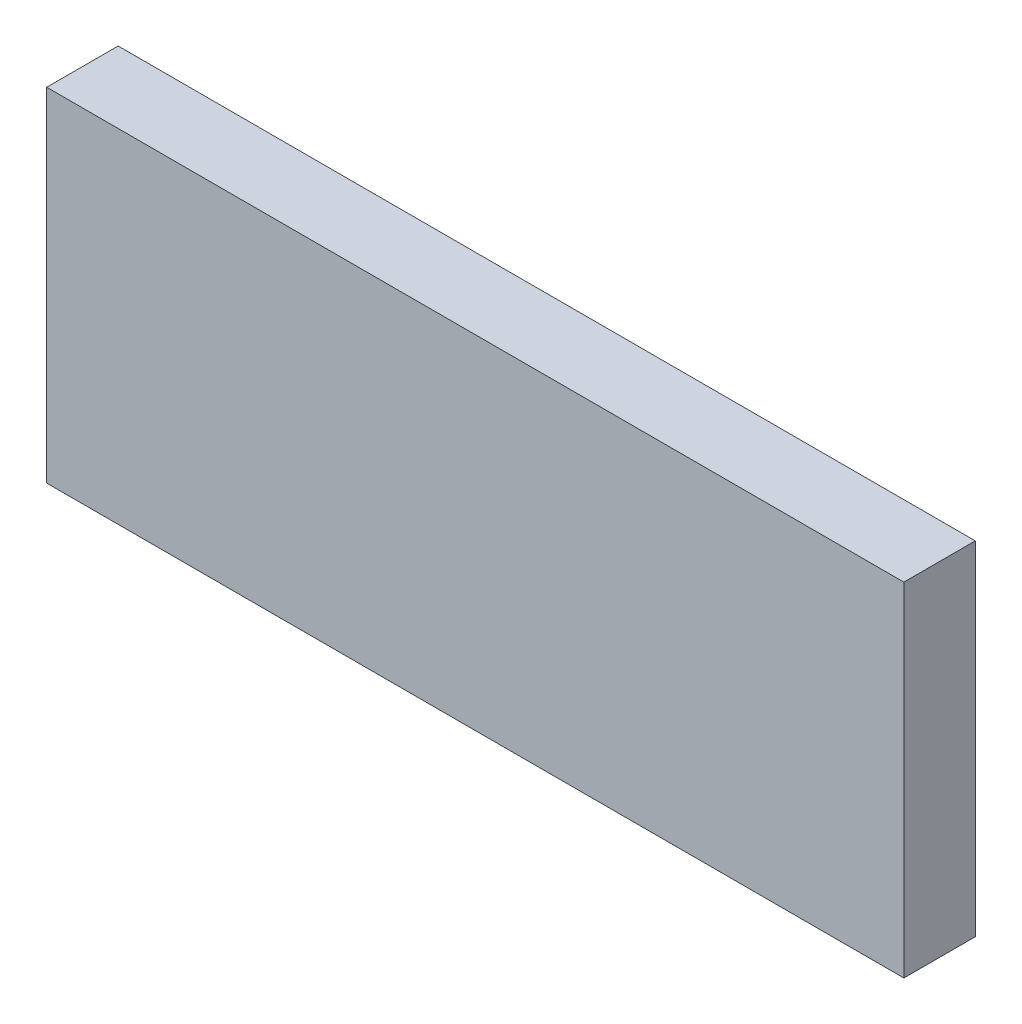
ISO-10303-21;
HEADER;
FILE_DESCRIPTION(('STEP AP214'),'2;1');
FILE_NAME('part.step','',(''),(''),'','','');
FILE_SCHEMA(('AUTOMOTIVE_DESIGN { 1 0 10303 214 1 1 1 1 }'));
ENDSEC;
DATA;
#1=APPLICATION_CONTEXT('core data for automotive mechanical design processes');
#2=APPLICATION_PROTOCOL_DEFINITION('international standard','automotive_design',2000,#1);
#3=PRODUCT_CONTEXT('',#1,'mechanical');
#4=PRODUCT('Part','Part','',(#3));
#5=PRODUCT_RELATED_PRODUCT_CATEGORY('part','',(#4));
#6=PRODUCT_DEFINITION_FORMATION('','',#4);
#7=PRODUCT_DEFINITION_CONTEXT('part definition',#1,'design');
#8=PRODUCT_DEFINITION('design','',#6,#7);
#9=PRODUCT_DEFINITION_SHAPE('','',#8);
#10=(LENGTH_UNIT() NAMED_UNIT(*) SI_UNIT(.MILLI.,.METRE.));
#11=(NAMED_UNIT(*) PLANE_ANGLE_UNIT() SI_UNIT($,.RADIAN.));
#12=(NAMED_UNIT(*) SI_UNIT($,.STERADIAN.) SOLID_ANGLE_UNIT());
#13=UNCERTAINTY_MEASURE_WITH_UNIT(LENGTH_MEASURE(1.E-05),#10,'distance_accuracy_value','');
#14=(GEOMETRIC_REPRESENTATION_CONTEXT(3) GLOBAL_UNCERTAINTY_ASSIGNED_CONTEXT((#13)) GLOBAL_UNIT_ASSIGNED_CONTEXT((#10,
#11,#12)) REPRESENTATION_CONTEXT('',''));
#15=CARTESIAN_POINT('',(0.,0.,0.));
#16=DIRECTION('',(0.,0.,1.));
#17=DIRECTION('',(1.,0.,0.));
#18=AXIS2_PLACEMENT_3D('',#15,#16,#17);
#19=CARTESIAN_POINT('',(-1.641156891067,0.,0.1));
#20=DIRECTION('',(0.,0.,1.));
#21=DIRECTION('',(1.,0.,0.));
#22=AXIS2_PLACEMENT_3D('',#19,#20,#21);
#23=PLANE('',#22);
#24=DIRECTION('',(1.,0.,0.));
#25=VECTOR('',#24,1.);
#26=CARTESIAN_POINT('',(-2.241156891067,0.24,0.1));
#27=LINE('',#26,#25);
#28=CARTESIAN_POINT('',(-2.241156891067,0.24,0.1));
#29=VERTEX_POINT('',#28);
#30=CARTESIAN_POINT('',(-1.041156891067,0.24,0.1));
#31=VERTEX_POINT('',#30);
#32=EDGE_CURVE('E90',#29,#31,#27,.T.);
#33=ORIENTED_EDGE('',*,*,#32,.F.);
#34=DIRECTION('',(0.,1.,0.));
#35=VECTOR('',#34,1.);
#36=CARTESIAN_POINT('',(-2.241156891067,-0.24,0.1));
#37=LINE('',#36,#35);
#38=CARTESIAN_POINT('',(-2.241156891067,-0.24,0.1));
#39=VERTEX_POINT('',#38);
#40=EDGE_CURVE('E21',#39,#29,#37,.T.);
#41=ORIENTED_EDGE('',*,*,#40,.F.);
#42=DIRECTION('',(-1.,0.,0.));
#43=VECTOR('',#42,1.);
#44=CARTESIAN_POINT('',(-1.041156891067,-0.24,0.1));
#45=LINE('',#44,#43);
#46=CARTESIAN_POINT('',(-1.041156891067,-0.24,0.1));
#47=VERTEX_POINT('',#46);
#48=EDGE_CURVE('E63',#47,#39,#45,.T.);
#49=ORIENTED_EDGE('',*,*,#48,.F.);
#50=DIRECTION('',(0.,-1.,0.));
#51=VECTOR('',#50,1.);
#52=CARTESIAN_POINT('',(-1.041156891067,0.24,0.1));
#53=LINE('',#52,#51);
#54=EDGE_CURVE('E92',#31,#47,#53,.T.);
#55=ORIENTED_EDGE('',*,*,#54,.F.);
#56=EDGE_LOOP('',(#33,#41,#49,#55));
#57=FACE_BOUND('',#56,.T.);
#58=ADVANCED_FACE('F17',(#57),#23,.T.);
#59=CARTESIAN_POINT('',(-1.641156891067,0.,0.));
#60=DIRECTION('',(0.,0.,1.));
#61=DIRECTION('',(1.,0.,0.));
#62=AXIS2_PLACEMENT_3D('',#59,#60,#61);
#63=PLANE('',#62);
#64=DIRECTION('',(1.,0.,0.));
#65=VECTOR('',#64,1.);
#66=CARTESIAN_POINT('',(-2.241156891067,0.24,0.));
#67=LINE('',#66,#65);
#68=CARTESIAN_POINT('',(-2.241156891067,0.24,0.));
#69=VERTEX_POINT('',#68);
#70=CARTESIAN_POINT('',(-1.041156891067,0.24,0.));
#71=VERTEX_POINT('',#70);
#72=EDGE_CURVE('E99',#69,#71,#67,.T.);
#73=ORIENTED_EDGE('',*,*,#72,.T.);
#74=DIRECTION('',(0.,-1.,0.));
#75=VECTOR('',#74,1.);
#76=CARTESIAN_POINT('',(-1.041156891067,0.24,0.));
#77=LINE('',#76,#75);
#78=CARTESIAN_POINT('',(-1.041156891067,-0.24,0.));
#79=VERTEX_POINT('',#78);
#80=EDGE_CURVE('E75',#71,#79,#77,.T.);
#81=ORIENTED_EDGE('',*,*,#80,.T.);
#82=DIRECTION('',(-1.,0.,0.));
#83=VECTOR('',#82,1.);
#84=CARTESIAN_POINT('',(-1.041156891067,-0.24,0.));
#85=LINE('',#84,#83);
#86=CARTESIAN_POINT('',(-2.241156891067,-0.24,0.));
#87=VERTEX_POINT('',#86);
#88=EDGE_CURVE('E88',#79,#87,#85,.T.);
#89=ORIENTED_EDGE('',*,*,#88,.T.);
#90=DIRECTION('',(0.,1.,0.));
#91=VECTOR('',#90,1.);
#92=CARTESIAN_POINT('',(-2.241156891067,-0.24,0.));
#93=LINE('',#92,#91);
#94=EDGE_CURVE('E11',#87,#69,#93,.T.);
#95=ORIENTED_EDGE('',*,*,#94,.T.);
#96=EDGE_LOOP('',(#73,#81,#89,#95));
#97=FACE_BOUND('',#96,.T.);
#98=ADVANCED_FACE('F19',(#97),#63,.F.);
#99=CARTESIAN_POINT('',(-2.241156891067,-0.24,0.));
#100=DIRECTION('',(-1.,0.,0.));
#101=DIRECTION('',(0.,0.,1.));
#102=AXIS2_PLACEMENT_3D('',#99,#100,#101);
#103=PLANE('',#102);
#104=DIRECTION('',(0.,0.,1.));
#105=VECTOR('',#104,1.);
#106=CARTESIAN_POINT('',(-2.241156891067,-0.24,0.));
#107=LINE('',#106,#105);
#108=EDGE_CURVE('E86',#87,#39,#107,.T.);
#109=ORIENTED_EDGE('',*,*,#108,.T.);
#110=ORIENTED_EDGE('',*,*,#40,.T.);
#111=DIRECTION('',(0.,0.,1.));
#112=VECTOR('',#111,1.);
#113=CARTESIAN_POINT('',(-2.241156891067,0.24,0.));
#114=LINE('',#113,#112);
#115=EDGE_CURVE('E84',#69,#29,#114,.T.);
#116=ORIENTED_EDGE('',*,*,#115,.F.);
#117=ORIENTED_EDGE('',*,*,#94,.F.);
#118=EDGE_LOOP('',(#109,#110,#116,#117));
#119=FACE_BOUND('',#118,.T.);
#120=ADVANCED_FACE('F82',(#119),#103,.T.);
#121=CARTESIAN_POINT('',(-1.041156891067,-0.24,0.));
#122=DIRECTION('',(0.,-1.,0.));
#123=DIRECTION('',(0.,0.,-1.));
#124=AXIS2_PLACEMENT_3D('',#121,#122,#123);
#125=PLANE('',#124);
#126=DIRECTION('',(0.,0.,1.));
#127=VECTOR('',#126,1.);
#128=CARTESIAN_POINT('',(-1.041156891067,-0.24,0.));
#129=LINE('',#128,#127);
#130=EDGE_CURVE('E106',#79,#47,#129,.T.);
#131=ORIENTED_EDGE('',*,*,#130,.T.);
#132=ORIENTED_EDGE('',*,*,#48,.T.);
#133=ORIENTED_EDGE('',*,*,#108,.F.);
#134=ORIENTED_EDGE('',*,*,#88,.F.);
#135=EDGE_LOOP('',(#131,#132,#133,#134));
#136=FACE_BOUND('',#135,.T.);
#137=ADVANCED_FACE('F139',(#136),#125,.T.);
#138=CARTESIAN_POINT('',(-1.041156891067,0.24,0.));
#139=DIRECTION('',(1.,0.,0.));
#140=DIRECTION('',(0.,1.,0.));
#141=AXIS2_PLACEMENT_3D('',#138,#139,#140);
#142=PLANE('',#141);
#143=DIRECTION('',(0.,0.,1.));
#144=VECTOR('',#143,1.);
#145=CARTESIAN_POINT('',(-1.041156891067,0.24,0.));
#146=LINE('',#145,#144);
#147=EDGE_CURVE('E96',#71,#31,#146,.T.);
#148=ORIENTED_EDGE('',*,*,#147,.T.);
#149=ORIENTED_EDGE('',*,*,#54,.T.);
#150=ORIENTED_EDGE('',*,*,#130,.F.);
#151=ORIENTED_EDGE('',*,*,#80,.F.);
#152=EDGE_LOOP('',(#148,#149,#150,#151));
#153=FACE_BOUND('',#152,.T.);
#154=ADVANCED_FACE('F129',(#153),#142,.T.);
#155=CARTESIAN_POINT('',(-2.241156891067,0.24,0.));
#156=DIRECTION('',(0.,1.,0.));
#157=DIRECTION('',(1.,0.,0.));
#158=AXIS2_PLACEMENT_3D('',#155,#156,#157);
#159=PLANE('',#158);
#160=ORIENTED_EDGE('',*,*,#115,.T.);
#161=ORIENTED_EDGE('',*,*,#32,.T.);
#162=ORIENTED_EDGE('',*,*,#147,.F.);
#163=ORIENTED_EDGE('',*,*,#72,.F.);
#164=EDGE_LOOP('',(#160,#161,#162,#163));
#165=FACE_BOUND('',#164,.T.);
#166=ADVANCED_FACE('F98',(#165),#159,.T.);
#167=CLOSED_SHELL('',(#58,#98,#120,#137,#154,#166));
#168=MANIFOLD_SOLID_BREP('B1',#167);
#169=ADVANCED_BREP_SHAPE_REPRESENTATION('',(#18,#168),#14);
#170=SHAPE_DEFINITION_REPRESENTATION(#9,#169);
ENDSEC;
END-ISO-10303-21;
